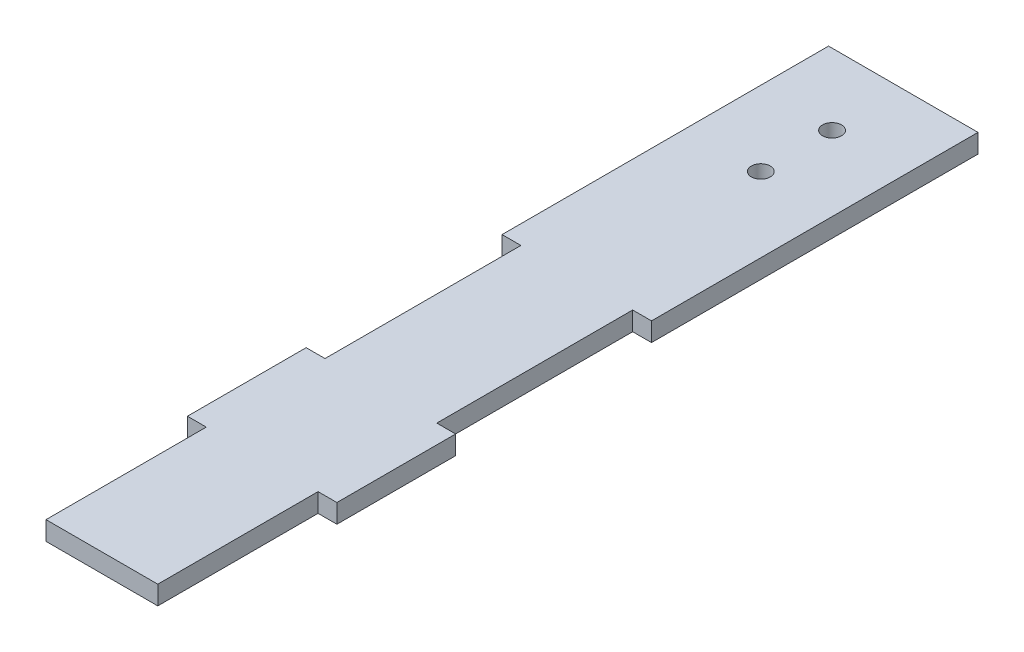
ISO-10303-21;
HEADER;
FILE_DESCRIPTION(('STEP AP214'),'2;1');
FILE_NAME('part.step','',(''),(''),'','','');
FILE_SCHEMA(('AUTOMOTIVE_DESIGN { 1 0 10303 214 1 1 1 1 }'));
ENDSEC;
DATA;
#1=APPLICATION_CONTEXT('core data for automotive mechanical design processes');
#2=APPLICATION_PROTOCOL_DEFINITION('international standard','automotive_design',2000,#1);
#3=PRODUCT_CONTEXT('',#1,'mechanical');
#4=PRODUCT('Part','Part','',(#3));
#5=PRODUCT_RELATED_PRODUCT_CATEGORY('part','',(#4));
#6=PRODUCT_DEFINITION_FORMATION('','',#4);
#7=PRODUCT_DEFINITION_CONTEXT('part definition',#1,'design');
#8=PRODUCT_DEFINITION('design','',#6,#7);
#9=PRODUCT_DEFINITION_SHAPE('','',#8);
#10=(LENGTH_UNIT() NAMED_UNIT(*) SI_UNIT(.MILLI.,.METRE.));
#11=(NAMED_UNIT(*) PLANE_ANGLE_UNIT() SI_UNIT($,.RADIAN.));
#12=(NAMED_UNIT(*) SI_UNIT($,.STERADIAN.) SOLID_ANGLE_UNIT());
#13=UNCERTAINTY_MEASURE_WITH_UNIT(LENGTH_MEASURE(1.E-05),#10,'distance_accuracy_value','');
#14=(GEOMETRIC_REPRESENTATION_CONTEXT(3) GLOBAL_UNCERTAINTY_ASSIGNED_CONTEXT((#13)) GLOBAL_UNIT_ASSIGNED_CONTEXT((#10,
#11,#12)) REPRESENTATION_CONTEXT('',''));
#15=CARTESIAN_POINT('',(0.,0.,0.));
#16=DIRECTION('',(0.,0.,1.));
#17=DIRECTION('',(1.,0.,0.));
#18=AXIS2_PLACEMENT_3D('',#15,#16,#17);
#19=CARTESIAN_POINT('',(12.5875,3.175,0.));
#20=DIRECTION('',(-1.,0.,0.));
#21=DIRECTION('',(0.,0.,1.));
#22=AXIS2_PLACEMENT_3D('',#19,#20,#21);
#23=PLANE('',#22);
#24=DIRECTION('',(0.,0.,-1.));
#25=VECTOR('',#24,1.);
#26=CARTESIAN_POINT('',(12.5875,0.,0.));
#27=LINE('',#26,#25);
#28=CARTESIAN_POINT('',(12.5875,0.,55.));
#29=VERTEX_POINT('',#28);
#30=CARTESIAN_POINT('',(12.5875,0.,0.));
#31=VERTEX_POINT('',#30);
#32=EDGE_CURVE('E177',#29,#31,#27,.T.);
#33=ORIENTED_EDGE('',*,*,#32,.T.);
#34=DIRECTION('',(0.,-1.,0.));
#35=VECTOR('',#34,1.);
#36=CARTESIAN_POINT('',(12.5875,3.175,0.));
#37=LINE('',#36,#35);
#38=CARTESIAN_POINT('',(12.5875,3.175,0.));
#39=VERTEX_POINT('',#38);
#40=EDGE_CURVE('E11',#39,#31,#37,.T.);
#41=ORIENTED_EDGE('',*,*,#40,.F.);
#42=DIRECTION('',(0.,0.,-1.));
#43=VECTOR('',#42,1.);
#44=CARTESIAN_POINT('',(12.5875,3.175,0.));
#45=LINE('',#44,#43);
#46=CARTESIAN_POINT('',(12.5875,3.175,55.));
#47=VERTEX_POINT('',#46);
#48=EDGE_CURVE('E208',#47,#39,#45,.T.);
#49=ORIENTED_EDGE('',*,*,#48,.F.);
#50=DIRECTION('',(0.,-1.,0.));
#51=VECTOR('',#50,1.);
#52=CARTESIAN_POINT('',(12.5875,3.175,55.));
#53=LINE('',#52,#51);
#54=EDGE_CURVE('E173',#47,#29,#53,.T.);
#55=ORIENTED_EDGE('',*,*,#54,.T.);
#56=EDGE_LOOP('',(#33,#41,#49,#55));
#57=FACE_BOUND('',#56,.T.);
#58=ADVANCED_FACE('F33',(#57),#23,.F.);
#59=CARTESIAN_POINT('',(-12.5875,3.175,0.));
#60=DIRECTION('',(0.,0.,1.));
#61=DIRECTION('',(1.,0.,0.));
#62=AXIS2_PLACEMENT_3D('',#59,#60,#61);
#63=PLANE('',#62);
#64=DIRECTION('',(-1.,0.,0.));
#65=VECTOR('',#64,1.);
#66=CARTESIAN_POINT('',(-12.5875,0.,0.));
#67=LINE('',#66,#65);
#68=CARTESIAN_POINT('',(-12.5875,0.,0.));
#69=VERTEX_POINT('',#68);
#70=EDGE_CURVE('E180',#31,#69,#67,.T.);
#71=ORIENTED_EDGE('',*,*,#70,.T.);
#72=DIRECTION('',(0.,-1.,0.));
#73=VECTOR('',#72,1.);
#74=CARTESIAN_POINT('',(-12.5875,3.175,0.));
#75=LINE('',#74,#73);
#76=CARTESIAN_POINT('',(-12.5875,3.175,0.));
#77=VERTEX_POINT('',#76);
#78=EDGE_CURVE('E41',#77,#69,#75,.T.);
#79=ORIENTED_EDGE('',*,*,#78,.F.);
#80=DIRECTION('',(-1.,0.,0.));
#81=VECTOR('',#80,1.);
#82=CARTESIAN_POINT('',(-12.5875,3.175,0.));
#83=LINE('',#82,#81);
#84=EDGE_CURVE('E116',#39,#77,#83,.T.);
#85=ORIENTED_EDGE('',*,*,#84,.F.);
#86=ORIENTED_EDGE('',*,*,#40,.T.);
#87=EDGE_LOOP('',(#71,#79,#85,#86));
#88=FACE_BOUND('',#87,.T.);
#89=ADVANCED_FACE('F307',(#88),#63,.F.);
#90=CARTESIAN_POINT('',(-12.5875,3.175,0.));
#91=DIRECTION('',(1.,0.,0.));
#92=DIRECTION('',(0.,0.,-1.));
#93=AXIS2_PLACEMENT_3D('',#90,#91,#92);
#94=PLANE('',#93);
#95=DIRECTION('',(0.,0.,1.));
#96=VECTOR('',#95,1.);
#97=CARTESIAN_POINT('',(-12.5875,0.,0.));
#98=LINE('',#97,#96);
#99=CARTESIAN_POINT('',(-12.5875,0.,55.));
#100=VERTEX_POINT('',#99);
#101=EDGE_CURVE('E183',#69,#100,#98,.T.);
#102=ORIENTED_EDGE('',*,*,#101,.T.);
#103=DIRECTION('',(0.,-1.,0.));
#104=VECTOR('',#103,1.);
#105=CARTESIAN_POINT('',(-12.5875,3.175,55.));
#106=LINE('',#105,#104);
#107=CARTESIAN_POINT('',(-12.5875,3.175,55.));
#108=VERTEX_POINT('',#107);
#109=EDGE_CURVE('E239',#108,#100,#106,.T.);
#110=ORIENTED_EDGE('',*,*,#109,.F.);
#111=DIRECTION('',(0.,0.,1.));
#112=VECTOR('',#111,1.);
#113=CARTESIAN_POINT('',(-12.5875,3.175,0.));
#114=LINE('',#113,#112);
#115=EDGE_CURVE('E247',#77,#108,#114,.T.);
#116=ORIENTED_EDGE('',*,*,#115,.F.);
#117=ORIENTED_EDGE('',*,*,#78,.T.);
#118=EDGE_LOOP('',(#102,#110,#116,#117));
#119=FACE_BOUND('',#118,.T.);
#120=ADVANCED_FACE('F245',(#119),#94,.F.);
#121=CARTESIAN_POINT('',(-12.5875,3.175,55.));
#122=DIRECTION('',(0.,0.,-1.));
#123=DIRECTION('',(-1.,0.,0.));
#124=AXIS2_PLACEMENT_3D('',#121,#122,#123);
#125=PLANE('',#124);
#126=DIRECTION('',(1.,0.,0.));
#127=VECTOR('',#126,1.);
#128=CARTESIAN_POINT('',(-12.5875,0.,55.));
#129=LINE('',#128,#127);
#130=CARTESIAN_POINT('',(-9.41499999999999,0.,55.));
#131=VERTEX_POINT('',#130);
#132=EDGE_CURVE('E185',#100,#131,#129,.T.);
#133=ORIENTED_EDGE('',*,*,#132,.T.);
#134=DIRECTION('',(0.,-1.,0.));
#135=VECTOR('',#134,1.);
#136=CARTESIAN_POINT('',(-9.41499999999999,3.175,55.));
#137=LINE('',#136,#135);
#138=CARTESIAN_POINT('',(-9.41499999999999,3.175,55.));
#139=VERTEX_POINT('',#138);
#140=EDGE_CURVE('E236',#139,#131,#137,.T.);
#141=ORIENTED_EDGE('',*,*,#140,.F.);
#142=DIRECTION('',(1.,0.,0.));
#143=VECTOR('',#142,1.);
#144=CARTESIAN_POINT('',(-12.5875,3.175,55.));
#145=LINE('',#144,#143);
#146=EDGE_CURVE('E265',#108,#139,#145,.T.);
#147=ORIENTED_EDGE('',*,*,#146,.F.);
#148=ORIENTED_EDGE('',*,*,#109,.T.);
#149=EDGE_LOOP('',(#133,#141,#147,#148));
#150=FACE_BOUND('',#149,.T.);
#151=ADVANCED_FACE('F256',(#150),#125,.F.);
#152=CARTESIAN_POINT('',(-9.41499999999999,3.175,55.));
#153=DIRECTION('',(1.,0.,0.));
#154=DIRECTION('',(0.,0.,-1.));
#155=AXIS2_PLACEMENT_3D('',#152,#153,#154);
#156=PLANE('',#155);
#157=DIRECTION('',(0.,0.,1.));
#158=VECTOR('',#157,1.);
#159=CARTESIAN_POINT('',(-9.41499999999999,0.,55.));
#160=LINE('',#159,#158);
#161=CARTESIAN_POINT('',(-9.41499999999999,0.,88.));
#162=VERTEX_POINT('',#161);
#163=EDGE_CURVE('E187',#131,#162,#160,.T.);
#164=ORIENTED_EDGE('',*,*,#163,.T.);
#165=DIRECTION('',(0.,-1.,0.));
#166=VECTOR('',#165,1.);
#167=CARTESIAN_POINT('',(-9.41499999999999,3.175,88.));
#168=LINE('',#167,#166);
#169=CARTESIAN_POINT('',(-9.41499999999999,3.175,88.));
#170=VERTEX_POINT('',#169);
#171=EDGE_CURVE('E233',#170,#162,#168,.T.);
#172=ORIENTED_EDGE('',*,*,#171,.F.);
#173=DIRECTION('',(0.,0.,1.));
#174=VECTOR('',#173,1.);
#175=CARTESIAN_POINT('',(-9.41499999999999,3.175,55.));
#176=LINE('',#175,#174);
#177=EDGE_CURVE('E262',#139,#170,#176,.T.);
#178=ORIENTED_EDGE('',*,*,#177,.F.);
#179=ORIENTED_EDGE('',*,*,#140,.T.);
#180=EDGE_LOOP('',(#164,#172,#178,#179));
#181=FACE_BOUND('',#180,.T.);
#182=ADVANCED_FACE('F260',(#181),#156,.F.);
#183=CARTESIAN_POINT('',(-9.41499999999999,3.175,88.));
#184=DIRECTION('',(0.,0.,1.));
#185=DIRECTION('',(1.,0.,0.));
#186=AXIS2_PLACEMENT_3D('',#183,#184,#185);
#187=PLANE('',#186);
#188=DIRECTION('',(-1.,0.,0.));
#189=VECTOR('',#188,1.);
#190=CARTESIAN_POINT('',(-9.41499999999999,0.,88.));
#191=LINE('',#190,#189);
#192=CARTESIAN_POINT('',(-12.59,0.,88.));
#193=VERTEX_POINT('',#192);
#194=EDGE_CURVE('E189',#162,#193,#191,.T.);
#195=ORIENTED_EDGE('',*,*,#194,.T.);
#196=DIRECTION('',(0.,-1.,0.));
#197=VECTOR('',#196,1.);
#198=CARTESIAN_POINT('',(-12.59,3.175,88.));
#199=LINE('',#198,#197);
#200=CARTESIAN_POINT('',(-12.59,3.175,88.));
#201=VERTEX_POINT('',#200);
#202=EDGE_CURVE('E230',#201,#193,#199,.T.);
#203=ORIENTED_EDGE('',*,*,#202,.F.);
#204=DIRECTION('',(-1.,0.,0.));
#205=VECTOR('',#204,1.);
#206=CARTESIAN_POINT('',(-9.41499999999999,3.175,88.));
#207=LINE('',#206,#205);
#208=EDGE_CURVE('E264',#170,#201,#207,.T.);
#209=ORIENTED_EDGE('',*,*,#208,.F.);
#210=ORIENTED_EDGE('',*,*,#171,.T.);
#211=EDGE_LOOP('',(#195,#203,#209,#210));
#212=FACE_BOUND('',#211,.T.);
#213=ADVANCED_FACE('F320',(#212),#187,.F.);
#214=CARTESIAN_POINT('',(-12.59,3.175,88.));
#215=DIRECTION('',(1.,0.,0.));
#216=DIRECTION('',(0.,0.,-1.));
#217=AXIS2_PLACEMENT_3D('',#214,#215,#216);
#218=PLANE('',#217);
#219=DIRECTION('',(0.,0.,1.));
#220=VECTOR('',#219,1.);
#221=CARTESIAN_POINT('',(-12.59,0.,88.));
#222=LINE('',#221,#220);
#223=CARTESIAN_POINT('',(-12.59,0.,108.));
#224=VERTEX_POINT('',#223);
#225=EDGE_CURVE('E191',#193,#224,#222,.T.);
#226=ORIENTED_EDGE('',*,*,#225,.T.);
#227=DIRECTION('',(0.,-1.,0.));
#228=VECTOR('',#227,1.);
#229=CARTESIAN_POINT('',(-12.59,3.175,108.));
#230=LINE('',#229,#228);
#231=CARTESIAN_POINT('',(-12.59,3.175,108.));
#232=VERTEX_POINT('',#231);
#233=EDGE_CURVE('E227',#232,#224,#230,.T.);
#234=ORIENTED_EDGE('',*,*,#233,.F.);
#235=DIRECTION('',(0.,0.,1.));
#236=VECTOR('',#235,1.);
#237=CARTESIAN_POINT('',(-12.59,3.175,88.));
#238=LINE('',#237,#236);
#239=EDGE_CURVE('E267',#201,#232,#238,.T.);
#240=ORIENTED_EDGE('',*,*,#239,.F.);
#241=ORIENTED_EDGE('',*,*,#202,.T.);
#242=EDGE_LOOP('',(#226,#234,#240,#241));
#243=FACE_BOUND('',#242,.T.);
#244=ADVANCED_FACE('F323',(#243),#218,.F.);
#245=CARTESIAN_POINT('',(-12.59,3.175,108.));
#246=DIRECTION('',(0.,0.,-1.));
#247=DIRECTION('',(-1.,0.,0.));
#248=AXIS2_PLACEMENT_3D('',#245,#246,#247);
#249=PLANE('',#248);
#250=DIRECTION('',(1.,0.,0.));
#251=VECTOR('',#250,1.);
#252=CARTESIAN_POINT('',(-12.59,0.,108.));
#253=LINE('',#252,#251);
#254=CARTESIAN_POINT('',(-9.41499999999999,0.,108.));
#255=VERTEX_POINT('',#254);
#256=EDGE_CURVE('E193',#224,#255,#253,.T.);
#257=ORIENTED_EDGE('',*,*,#256,.T.);
#258=DIRECTION('',(0.,-1.,0.));
#259=VECTOR('',#258,1.);
#260=CARTESIAN_POINT('',(-9.41499999999999,3.175,108.));
#261=LINE('',#260,#259);
#262=CARTESIAN_POINT('',(-9.41499999999999,3.175,108.));
#263=VERTEX_POINT('',#262);
#264=EDGE_CURVE('E224',#263,#255,#261,.T.);
#265=ORIENTED_EDGE('',*,*,#264,.F.);
#266=DIRECTION('',(1.,0.,0.));
#267=VECTOR('',#266,1.);
#268=CARTESIAN_POINT('',(-12.59,3.175,108.));
#269=LINE('',#268,#267);
#270=EDGE_CURVE('E273',#232,#263,#269,.T.);
#271=ORIENTED_EDGE('',*,*,#270,.F.);
#272=ORIENTED_EDGE('',*,*,#233,.T.);
#273=EDGE_LOOP('',(#257,#265,#271,#272));
#274=FACE_BOUND('',#273,.T.);
#275=ADVANCED_FACE('F327',(#274),#249,.F.);
#276=CARTESIAN_POINT('',(-9.41499999999999,3.175,108.));
#277=DIRECTION('',(1.,0.,0.));
#278=DIRECTION('',(0.,0.,-1.));
#279=AXIS2_PLACEMENT_3D('',#276,#277,#278);
#280=PLANE('',#279);
#281=DIRECTION('',(0.,0.,1.));
#282=VECTOR('',#281,1.);
#283=CARTESIAN_POINT('',(-9.41499999999999,0.,108.));
#284=LINE('',#283,#282);
#285=CARTESIAN_POINT('',(-9.41499999999998,0.,135.));
#286=VERTEX_POINT('',#285);
#287=EDGE_CURVE('E195',#255,#286,#284,.T.);
#288=ORIENTED_EDGE('',*,*,#287,.T.);
#289=DIRECTION('',(0.,-1.,0.));
#290=VECTOR('',#289,1.);
#291=CARTESIAN_POINT('',(-9.41499999999998,3.175,135.));
#292=LINE('',#291,#290);
#293=CARTESIAN_POINT('',(-9.41499999999998,3.175,135.));
#294=VERTEX_POINT('',#293);
#295=EDGE_CURVE('E221',#294,#286,#292,.T.);
#296=ORIENTED_EDGE('',*,*,#295,.F.);
#297=DIRECTION('',(0.,0.,1.));
#298=VECTOR('',#297,1.);
#299=CARTESIAN_POINT('',(-9.41499999999999,3.175,108.));
#300=LINE('',#299,#298);
#301=EDGE_CURVE('E275',#263,#294,#300,.T.);
#302=ORIENTED_EDGE('',*,*,#301,.F.);
#303=ORIENTED_EDGE('',*,*,#264,.T.);
#304=EDGE_LOOP('',(#288,#296,#302,#303));
#305=FACE_BOUND('',#304,.T.);
#306=ADVANCED_FACE('F331',(#305),#280,.F.);
#307=CARTESIAN_POINT('',(9.41500000000002,3.175,135.));
#308=DIRECTION('',(0.,0.,-1.));
#309=DIRECTION('',(-1.,0.,0.));
#310=AXIS2_PLACEMENT_3D('',#307,#308,#309);
#311=PLANE('',#310);
#312=DIRECTION('',(1.,0.,0.));
#313=VECTOR('',#312,1.);
#314=CARTESIAN_POINT('',(9.41500000000002,0.,135.));
#315=LINE('',#314,#313);
#316=CARTESIAN_POINT('',(9.41500000000002,0.,135.));
#317=VERTEX_POINT('',#316);
#318=EDGE_CURVE('E197',#286,#317,#315,.T.);
#319=ORIENTED_EDGE('',*,*,#318,.T.);
#320=DIRECTION('',(0.,-1.,0.));
#321=VECTOR('',#320,1.);
#322=CARTESIAN_POINT('',(9.41500000000002,3.175,135.));
#323=LINE('',#322,#321);
#324=CARTESIAN_POINT('',(9.41500000000002,3.175,135.));
#325=VERTEX_POINT('',#324);
#326=EDGE_CURVE('E218',#325,#317,#323,.T.);
#327=ORIENTED_EDGE('',*,*,#326,.F.);
#328=DIRECTION('',(1.,0.,0.));
#329=VECTOR('',#328,1.);
#330=CARTESIAN_POINT('',(9.41500000000002,3.175,135.));
#331=LINE('',#330,#329);
#332=EDGE_CURVE('E277',#294,#325,#331,.T.);
#333=ORIENTED_EDGE('',*,*,#332,.F.);
#334=ORIENTED_EDGE('',*,*,#295,.T.);
#335=EDGE_LOOP('',(#319,#327,#333,#334));
#336=FACE_BOUND('',#335,.T.);
#337=ADVANCED_FACE('F335',(#336),#311,.F.);
#338=CARTESIAN_POINT('',(9.41500000000002,3.175,108.));
#339=DIRECTION('',(-1.,0.,0.));
#340=DIRECTION('',(0.,0.,1.));
#341=AXIS2_PLACEMENT_3D('',#338,#339,#340);
#342=PLANE('',#341);
#343=DIRECTION('',(0.,0.,-1.));
#344=VECTOR('',#343,1.);
#345=CARTESIAN_POINT('',(9.41500000000002,0.,108.));
#346=LINE('',#345,#344);
#347=CARTESIAN_POINT('',(9.41500000000002,0.,108.));
#348=VERTEX_POINT('',#347);
#349=EDGE_CURVE('E199',#317,#348,#346,.T.);
#350=ORIENTED_EDGE('',*,*,#349,.T.);
#351=DIRECTION('',(0.,-1.,0.));
#352=VECTOR('',#351,1.);
#353=CARTESIAN_POINT('',(9.41500000000002,3.175,108.));
#354=LINE('',#353,#352);
#355=CARTESIAN_POINT('',(9.41500000000002,3.175,108.));
#356=VERTEX_POINT('',#355);
#357=EDGE_CURVE('E215',#356,#348,#354,.T.);
#358=ORIENTED_EDGE('',*,*,#357,.F.);
#359=DIRECTION('',(0.,0.,-1.));
#360=VECTOR('',#359,1.);
#361=CARTESIAN_POINT('',(9.41500000000002,3.175,108.));
#362=LINE('',#361,#360);
#363=EDGE_CURVE('E279',#325,#356,#362,.T.);
#364=ORIENTED_EDGE('',*,*,#363,.F.);
#365=ORIENTED_EDGE('',*,*,#326,.T.);
#366=EDGE_LOOP('',(#350,#358,#364,#365));
#367=FACE_BOUND('',#366,.T.);
#368=ADVANCED_FACE('F339',(#367),#342,.F.);
#369=CARTESIAN_POINT('',(12.59,3.175,108.));
#370=DIRECTION('',(0.,0.,-1.));
#371=DIRECTION('',(-1.,0.,0.));
#372=AXIS2_PLACEMENT_3D('',#369,#370,#371);
#373=PLANE('',#372);
#374=DIRECTION('',(1.,0.,0.));
#375=VECTOR('',#374,1.);
#376=CARTESIAN_POINT('',(12.59,0.,108.));
#377=LINE('',#376,#375);
#378=CARTESIAN_POINT('',(12.59,0.,108.));
#379=VERTEX_POINT('',#378);
#380=EDGE_CURVE('E201',#348,#379,#377,.T.);
#381=ORIENTED_EDGE('',*,*,#380,.T.);
#382=DIRECTION('',(0.,-1.,0.));
#383=VECTOR('',#382,1.);
#384=CARTESIAN_POINT('',(12.59,3.175,108.));
#385=LINE('',#384,#383);
#386=CARTESIAN_POINT('',(12.59,3.175,108.));
#387=VERTEX_POINT('',#386);
#388=EDGE_CURVE('E212',#387,#379,#385,.T.);
#389=ORIENTED_EDGE('',*,*,#388,.F.);
#390=DIRECTION('',(1.,0.,0.));
#391=VECTOR('',#390,1.);
#392=CARTESIAN_POINT('',(12.59,3.175,108.));
#393=LINE('',#392,#391);
#394=EDGE_CURVE('E281',#356,#387,#393,.T.);
#395=ORIENTED_EDGE('',*,*,#394,.F.);
#396=ORIENTED_EDGE('',*,*,#357,.T.);
#397=EDGE_LOOP('',(#381,#389,#395,#396));
#398=FACE_BOUND('',#397,.T.);
#399=ADVANCED_FACE('F287',(#398),#373,.F.);
#400=CARTESIAN_POINT('',(12.59,3.175,88.));
#401=DIRECTION('',(-1.,0.,0.));
#402=DIRECTION('',(0.,0.,1.));
#403=AXIS2_PLACEMENT_3D('',#400,#401,#402);
#404=PLANE('',#403);
#405=DIRECTION('',(0.,0.,-1.));
#406=VECTOR('',#405,1.);
#407=CARTESIAN_POINT('',(12.59,0.,88.));
#408=LINE('',#407,#406);
#409=CARTESIAN_POINT('',(12.59,0.,88.));
#410=VERTEX_POINT('',#409);
#411=EDGE_CURVE('E203',#379,#410,#408,.T.);
#412=ORIENTED_EDGE('',*,*,#411,.T.);
#413=DIRECTION('',(0.,-1.,0.));
#414=VECTOR('',#413,1.);
#415=CARTESIAN_POINT('',(12.59,3.175,88.));
#416=LINE('',#415,#414);
#417=CARTESIAN_POINT('',(12.59,3.175,88.));
#418=VERTEX_POINT('',#417);
#419=EDGE_CURVE('E168',#418,#410,#416,.T.);
#420=ORIENTED_EDGE('',*,*,#419,.F.);
#421=DIRECTION('',(0.,0.,-1.));
#422=VECTOR('',#421,1.);
#423=CARTESIAN_POINT('',(12.59,3.175,88.));
#424=LINE('',#423,#422);
#425=EDGE_CURVE('E159',#387,#418,#424,.T.);
#426=ORIENTED_EDGE('',*,*,#425,.F.);
#427=ORIENTED_EDGE('',*,*,#388,.T.);
#428=EDGE_LOOP('',(#412,#420,#426,#427));
#429=FACE_BOUND('',#428,.T.);
#430=ADVANCED_FACE('F291',(#429),#404,.F.);
#431=CARTESIAN_POINT('',(9.41500000000001,3.175,88.));
#432=DIRECTION('',(0.,0.,1.));
#433=DIRECTION('',(1.,0.,0.));
#434=AXIS2_PLACEMENT_3D('',#431,#432,#433);
#435=PLANE('',#434);
#436=DIRECTION('',(-1.,0.,0.));
#437=VECTOR('',#436,1.);
#438=CARTESIAN_POINT('',(9.41500000000001,0.,88.));
#439=LINE('',#438,#437);
#440=CARTESIAN_POINT('',(9.41500000000001,0.,88.));
#441=VERTEX_POINT('',#440);
#442=EDGE_CURVE('E167',#410,#441,#439,.T.);
#443=ORIENTED_EDGE('',*,*,#442,.T.);
#444=DIRECTION('',(0.,-1.,0.));
#445=VECTOR('',#444,1.);
#446=CARTESIAN_POINT('',(9.41500000000001,3.175,88.));
#447=LINE('',#446,#445);
#448=CARTESIAN_POINT('',(9.41500000000001,3.175,88.));
#449=VERTEX_POINT('',#448);
#450=EDGE_CURVE('E164',#449,#441,#447,.T.);
#451=ORIENTED_EDGE('',*,*,#450,.F.);
#452=DIRECTION('',(-1.,0.,0.));
#453=VECTOR('',#452,1.);
#454=CARTESIAN_POINT('',(9.41500000000001,3.175,88.));
#455=LINE('',#454,#453);
#456=EDGE_CURVE('E153',#418,#449,#455,.T.);
#457=ORIENTED_EDGE('',*,*,#456,.F.);
#458=ORIENTED_EDGE('',*,*,#419,.T.);
#459=EDGE_LOOP('',(#443,#451,#457,#458));
#460=FACE_BOUND('',#459,.T.);
#461=ADVANCED_FACE('F165',(#460),#435,.F.);
#462=CARTESIAN_POINT('',(9.41500000000001,3.175,55.));
#463=DIRECTION('',(-1.,0.,0.));
#464=DIRECTION('',(0.,0.,1.));
#465=AXIS2_PLACEMENT_3D('',#462,#463,#464);
#466=PLANE('',#465);
#467=DIRECTION('',(0.,0.,-1.));
#468=VECTOR('',#467,1.);
#469=CARTESIAN_POINT('',(9.41500000000001,0.,55.));
#470=LINE('',#469,#468);
#471=CARTESIAN_POINT('',(9.41500000000001,0.,55.));
#472=VERTEX_POINT('',#471);
#473=EDGE_CURVE('E102',#441,#472,#470,.T.);
#474=ORIENTED_EDGE('',*,*,#473,.T.);
#475=DIRECTION('',(0.,-1.,0.));
#476=VECTOR('',#475,1.);
#477=CARTESIAN_POINT('',(9.41500000000001,3.175,55.));
#478=LINE('',#477,#476);
#479=CARTESIAN_POINT('',(9.41500000000001,3.175,55.));
#480=VERTEX_POINT('',#479);
#481=EDGE_CURVE('E169',#480,#472,#478,.T.);
#482=ORIENTED_EDGE('',*,*,#481,.F.);
#483=DIRECTION('',(0.,0.,-1.));
#484=VECTOR('',#483,1.);
#485=CARTESIAN_POINT('',(9.41500000000001,3.175,55.));
#486=LINE('',#485,#484);
#487=EDGE_CURVE('E157',#449,#480,#486,.T.);
#488=ORIENTED_EDGE('',*,*,#487,.F.);
#489=ORIENTED_EDGE('',*,*,#450,.T.);
#490=EDGE_LOOP('',(#474,#482,#488,#489));
#491=FACE_BOUND('',#490,.T.);
#492=ADVANCED_FACE('F171',(#491),#466,.F.);
#493=CARTESIAN_POINT('',(12.5875,3.175,55.));
#494=DIRECTION('',(0.,0.,-1.));
#495=DIRECTION('',(-1.,0.,0.));
#496=AXIS2_PLACEMENT_3D('',#493,#494,#495);
#497=PLANE('',#496);
#498=DIRECTION('',(1.,0.,0.));
#499=VECTOR('',#498,1.);
#500=CARTESIAN_POINT('',(12.5875,0.,55.));
#501=LINE('',#500,#499);
#502=EDGE_CURVE('E108',#472,#29,#501,.T.);
#503=ORIENTED_EDGE('',*,*,#502,.T.);
#504=ORIENTED_EDGE('',*,*,#54,.F.);
#505=DIRECTION('',(1.,0.,0.));
#506=VECTOR('',#505,1.);
#507=CARTESIAN_POINT('',(12.5875,3.175,55.));
#508=LINE('',#507,#506);
#509=EDGE_CURVE('E49',#480,#47,#508,.T.);
#510=ORIENTED_EDGE('',*,*,#509,.F.);
#511=ORIENTED_EDGE('',*,*,#481,.T.);
#512=EDGE_LOOP('',(#503,#504,#510,#511));
#513=FACE_BOUND('',#512,.T.);
#514=ADVANCED_FACE('F295',(#513),#497,.F.);
#515=CARTESIAN_POINT('',(0.,3.175,0.));
#516=DIRECTION('',(0.,-1.,0.));
#517=DIRECTION('',(0.,0.,-1.));
#518=AXIS2_PLACEMENT_3D('',#515,#516,#517);
#519=PLANE('',#518);
#520=CARTESIAN_POINT('',(0.,3.175,24.));
#521=DIRECTION('',(0.,-1.,0.));
#522=DIRECTION('',(0.,0.,-1.));
#523=AXIS2_PLACEMENT_3D('',#520,#521,#522);
#524=CIRCLE('',#523,1.6);
#525=CARTESIAN_POINT('',(0.,3.175,22.4));
#526=VERTEX_POINT('',#525);
#527=EDGE_CURVE('E181',#526,#526,#524,.T.);
#528=ORIENTED_EDGE('',*,*,#527,.T.);
#529=EDGE_LOOP('',(#528));
#530=FACE_BOUND('',#529,.T.);
#531=CARTESIAN_POINT('',(0.,3.175,12.));
#532=DIRECTION('',(0.,-1.,0.));
#533=DIRECTION('',(0.,0.,-1.));
#534=AXIS2_PLACEMENT_3D('',#531,#532,#533);
#535=CIRCLE('',#534,1.6);
#536=CARTESIAN_POINT('',(0.,3.175,10.4));
#537=VERTEX_POINT('',#536);
#538=EDGE_CURVE('E405',#537,#537,#535,.T.);
#539=ORIENTED_EDGE('',*,*,#538,.T.);
#540=EDGE_LOOP('',(#539));
#541=FACE_BOUND('',#540,.T.);
#542=ORIENTED_EDGE('',*,*,#48,.T.);
#543=ORIENTED_EDGE('',*,*,#84,.T.);
#544=ORIENTED_EDGE('',*,*,#115,.T.);
#545=ORIENTED_EDGE('',*,*,#146,.T.);
#546=ORIENTED_EDGE('',*,*,#177,.T.);
#547=ORIENTED_EDGE('',*,*,#208,.T.);
#548=ORIENTED_EDGE('',*,*,#239,.T.);
#549=ORIENTED_EDGE('',*,*,#270,.T.);
#550=ORIENTED_EDGE('',*,*,#301,.T.);
#551=ORIENTED_EDGE('',*,*,#332,.T.);
#552=ORIENTED_EDGE('',*,*,#363,.T.);
#553=ORIENTED_EDGE('',*,*,#394,.T.);
#554=ORIENTED_EDGE('',*,*,#425,.T.);
#555=ORIENTED_EDGE('',*,*,#456,.T.);
#556=ORIENTED_EDGE('',*,*,#487,.T.);
#557=ORIENTED_EDGE('',*,*,#509,.T.);
#558=EDGE_LOOP('',(#542,#543,#544,#545,#546,#547,#548,#549,#550,#551,#552,#553,#554,#555,#556,#557));
#559=FACE_BOUND('',#558,.T.);
#560=ADVANCED_FACE('F155',(#530,#541,#559),#519,.F.);
#561=CARTESIAN_POINT('',(0.,0.,0.));
#562=DIRECTION('',(0.,-1.,0.));
#563=DIRECTION('',(0.,0.,-1.));
#564=AXIS2_PLACEMENT_3D('',#561,#562,#563);
#565=PLANE('',#564);
#566=CARTESIAN_POINT('',(0.,0.,24.));
#567=DIRECTION('',(0.,1.,0.));
#568=DIRECTION('',(0.,0.,1.));
#569=AXIS2_PLACEMENT_3D('',#566,#567,#568);
#570=CIRCLE('',#569,1.6);
#571=CARTESIAN_POINT('',(0.,0.,25.6));
#572=VERTEX_POINT('',#571);
#573=EDGE_CURVE('E402',#572,#572,#570,.T.);
#574=ORIENTED_EDGE('',*,*,#573,.T.);
#575=EDGE_LOOP('',(#574));
#576=FACE_BOUND('',#575,.T.);
#577=CARTESIAN_POINT('',(0.,0.,12.));
#578=DIRECTION('',(0.,1.,0.));
#579=DIRECTION('',(0.,0.,1.));
#580=AXIS2_PLACEMENT_3D('',#577,#578,#579);
#581=CIRCLE('',#580,1.6);
#582=CARTESIAN_POINT('',(0.,0.,13.6));
#583=VERTEX_POINT('',#582);
#584=EDGE_CURVE('E412',#583,#583,#581,.T.);
#585=ORIENTED_EDGE('',*,*,#584,.T.);
#586=EDGE_LOOP('',(#585));
#587=FACE_BOUND('',#586,.T.);
#588=ORIENTED_EDGE('',*,*,#32,.F.);
#589=ORIENTED_EDGE('',*,*,#502,.F.);
#590=ORIENTED_EDGE('',*,*,#473,.F.);
#591=ORIENTED_EDGE('',*,*,#442,.F.);
#592=ORIENTED_EDGE('',*,*,#411,.F.);
#593=ORIENTED_EDGE('',*,*,#380,.F.);
#594=ORIENTED_EDGE('',*,*,#349,.F.);
#595=ORIENTED_EDGE('',*,*,#318,.F.);
#596=ORIENTED_EDGE('',*,*,#287,.F.);
#597=ORIENTED_EDGE('',*,*,#256,.F.);
#598=ORIENTED_EDGE('',*,*,#225,.F.);
#599=ORIENTED_EDGE('',*,*,#194,.F.);
#600=ORIENTED_EDGE('',*,*,#163,.F.);
#601=ORIENTED_EDGE('',*,*,#132,.F.);
#602=ORIENTED_EDGE('',*,*,#101,.F.);
#603=ORIENTED_EDGE('',*,*,#70,.F.);
#604=EDGE_LOOP('',(#588,#589,#590,#591,#592,#593,#594,#595,#596,#597,#598,#599,#600,#601,#602,#603));
#605=FACE_BOUND('',#604,.T.);
#606=ADVANCED_FACE('F251',(#576,#587,#605),#565,.T.);
#607=CARTESIAN_POINT('',(0.,0.,12.));
#608=DIRECTION('',(0.,1.,0.));
#609=DIRECTION('',(0.,0.,1.));
#610=AXIS2_PLACEMENT_3D('',#607,#608,#609);
#611=CYLINDRICAL_SURFACE('',#610,1.6);
#612=ORIENTED_EDGE('',*,*,#584,.F.);
#613=EDGE_LOOP('',(#612));
#614=FACE_BOUND('',#613,.T.);
#615=ORIENTED_EDGE('',*,*,#538,.F.);
#616=EDGE_LOOP('',(#615));
#617=FACE_BOUND('',#616,.T.);
#618=ADVANCED_FACE('F376',(#614,#617),#611,.F.);
#619=CARTESIAN_POINT('',(0.,0.,24.));
#620=DIRECTION('',(0.,1.,0.));
#621=DIRECTION('',(0.,0.,1.));
#622=AXIS2_PLACEMENT_3D('',#619,#620,#621);
#623=CYLINDRICAL_SURFACE('',#622,1.6);
#624=ORIENTED_EDGE('',*,*,#573,.F.);
#625=EDGE_LOOP('',(#624));
#626=FACE_BOUND('',#625,.T.);
#627=ORIENTED_EDGE('',*,*,#527,.F.);
#628=EDGE_LOOP('',(#627));
#629=FACE_BOUND('',#628,.T.);
#630=ADVANCED_FACE('F385',(#626,#629),#623,.F.);
#631=CLOSED_SHELL('',(#58,#89,#120,#151,#182,#213,#244,#275,#306,#337,#368,#399,#430,#461,#492,
#514,#560,#606,#618,#630));
#632=MANIFOLD_SOLID_BREP('B2',#631);
#633=ADVANCED_BREP_SHAPE_REPRESENTATION('',(#18,#632),#14);
#634=SHAPE_DEFINITION_REPRESENTATION(#9,#633);
ENDSEC;
END-ISO-10303-21;
